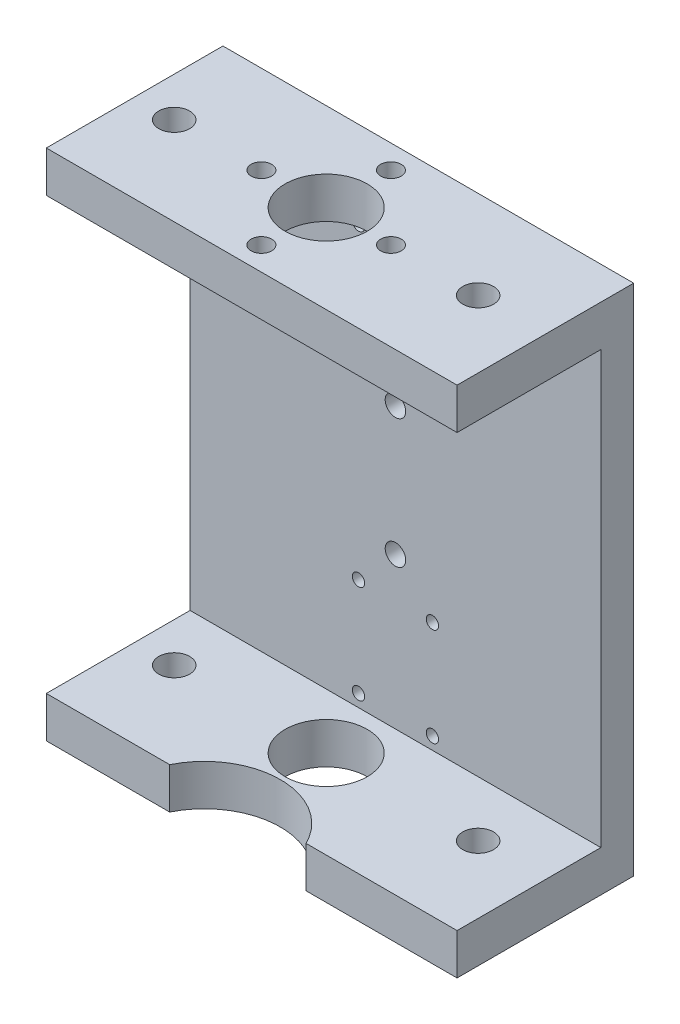
ISO-10303-21;
HEADER;
FILE_DESCRIPTION(('STEP AP214'),'2;1');
FILE_NAME('part.step','',(''),(''),'','','');
FILE_SCHEMA(('AUTOMOTIVE_DESIGN { 1 0 10303 214 1 1 1 1 }'));
ENDSEC;
DATA;
#1=APPLICATION_CONTEXT('core data for automotive mechanical design processes');
#2=APPLICATION_PROTOCOL_DEFINITION('international standard','automotive_design',2000,#1);
#3=PRODUCT_CONTEXT('',#1,'mechanical');
#4=PRODUCT('Part','Part','',(#3));
#5=PRODUCT_RELATED_PRODUCT_CATEGORY('part','',(#4));
#6=PRODUCT_DEFINITION_FORMATION('','',#4);
#7=PRODUCT_DEFINITION_CONTEXT('part definition',#1,'design');
#8=PRODUCT_DEFINITION('design','',#6,#7);
#9=PRODUCT_DEFINITION_SHAPE('','',#8);
#10=(LENGTH_UNIT() NAMED_UNIT(*) SI_UNIT(.MILLI.,.METRE.));
#11=(NAMED_UNIT(*) PLANE_ANGLE_UNIT() SI_UNIT($,.RADIAN.));
#12=(NAMED_UNIT(*) SI_UNIT($,.STERADIAN.) SOLID_ANGLE_UNIT());
#13=UNCERTAINTY_MEASURE_WITH_UNIT(LENGTH_MEASURE(1.E-05),#10,'distance_accuracy_value','');
#14=(GEOMETRIC_REPRESENTATION_CONTEXT(3) GLOBAL_UNCERTAINTY_ASSIGNED_CONTEXT((#13)) GLOBAL_UNIT_ASSIGNED_CONTEXT((#10,
#11,#12)) REPRESENTATION_CONTEXT('',''));
#15=CARTESIAN_POINT('',(0.,0.,0.));
#16=DIRECTION('',(0.,0.,1.));
#17=DIRECTION('',(1.,0.,0.));
#18=AXIS2_PLACEMENT_3D('',#15,#16,#17);
#19=CARTESIAN_POINT('',(0.,0.,43.));
#20=DIRECTION('',(0.,0.,1.));
#21=DIRECTION('',(1.,0.,0.));
#22=AXIS2_PLACEMENT_3D('',#19,#20,#21);
#23=PLANE('',#22);
#24=DIRECTION('',(0.,1.,0.));
#25=VECTOR('',#24,1.);
#26=CARTESIAN_POINT('',(13.2357905863533,-45.0000000000001,43.));
#27=LINE('',#26,#25);
#28=CARTESIAN_POINT('',(13.2357905863533,-45.0000000000001,43.));
#29=VERTEX_POINT('',#28);
#30=CARTESIAN_POINT('',(13.2357905863533,-35.,43.));
#31=VERTEX_POINT('',#30);
#32=EDGE_CURVE('E320',#29,#31,#27,.T.);
#33=ORIENTED_EDGE('',*,*,#32,.F.);
#34=DIRECTION('',(1.,0.,0.));
#35=VECTOR('',#34,1.);
#36=CARTESIAN_POINT('',(-50.,-45.,43.));
#37=LINE('',#36,#35);
#38=CARTESIAN_POINT('',(49.9999999999999,-45.,43.));
#39=VERTEX_POINT('',#38);
#40=EDGE_CURVE('E205',#29,#39,#37,.T.);
#41=ORIENTED_EDGE('',*,*,#40,.T.);
#42=DIRECTION('',(0.,1.,0.));
#43=VECTOR('',#42,1.);
#44=CARTESIAN_POINT('',(49.9999999999999,-45.,43.));
#45=LINE('',#44,#43);
#46=CARTESIAN_POINT('',(49.9999999999999,-35.,43.));
#47=VERTEX_POINT('',#46);
#48=EDGE_CURVE('E203',#39,#47,#45,.T.);
#49=ORIENTED_EDGE('',*,*,#48,.T.);
#50=DIRECTION('',(-1.,0.,0.));
#51=VECTOR('',#50,1.);
#52=CARTESIAN_POINT('',(49.9999999999999,-35.,43.));
#53=LINE('',#52,#51);
#54=EDGE_CURVE('E200',#47,#31,#53,.T.);
#55=ORIENTED_EDGE('',*,*,#54,.T.);
#56=EDGE_LOOP('',(#33,#41,#49,#55));
#57=FACE_BOUND('',#56,.T.);
#58=ADVANCED_FACE('F43',(#57),#23,.T.);
#59=CARTESIAN_POINT('',(0.,0.,8.));
#60=DIRECTION('',(0.,0.,1.));
#61=DIRECTION('',(1.,0.,0.));
#62=AXIS2_PLACEMENT_3D('',#59,#60,#61);
#63=PLANE('',#62);
#64=DIRECTION('',(0.,1.,0.));
#65=VECTOR('',#64,1.);
#66=CARTESIAN_POINT('',(-2.31757458499423,60.,8.));
#67=LINE('',#66,#65);
#68=CARTESIAN_POINT('',(-2.31757458499423,60.,8.));
#69=VERTEX_POINT('',#68);
#70=CARTESIAN_POINT('',(-2.31757458499423,70.,8.));
#71=VERTEX_POINT('',#70);
#72=EDGE_CURVE('E58',#69,#71,#67,.T.);
#73=ORIENTED_EDGE('',*,*,#72,.F.);
#74=DIRECTION('',(-1.,0.,0.));
#75=VECTOR('',#74,1.);
#76=CARTESIAN_POINT('',(0.,60.,8.));
#77=LINE('',#76,#75);
#78=CARTESIAN_POINT('',(-4.41242541500578,60.,8.));
#79=VERTEX_POINT('',#78);
#80=EDGE_CURVE('E11',#69,#79,#77,.T.);
#81=ORIENTED_EDGE('',*,*,#80,.T.);
#82=DIRECTION('',(0.,1.,0.));
#83=VECTOR('',#82,1.);
#84=CARTESIAN_POINT('',(-4.41242541500578,60.,8.));
#85=LINE('',#84,#83);
#86=CARTESIAN_POINT('',(-4.41242541500578,70.,8.));
#87=VERTEX_POINT('',#86);
#88=EDGE_CURVE('E138',#87,#79,#85,.F.);
#89=ORIENTED_EDGE('',*,*,#88,.F.);
#90=DIRECTION('',(1.,0.,0.));
#91=VECTOR('',#90,1.);
#92=CARTESIAN_POINT('',(50.,70.,8.));
#93=LINE('',#92,#91);
#94=CARTESIAN_POINT('',(-50.,70.,8.));
#95=VERTEX_POINT('',#94);
#96=EDGE_CURVE('E212',#95,#87,#93,.T.);
#97=ORIENTED_EDGE('',*,*,#96,.F.);
#98=DIRECTION('',(0.,-1.,0.));
#99=VECTOR('',#98,1.);
#100=CARTESIAN_POINT('',(-50.,80.,8.));
#101=LINE('',#100,#99);
#102=CARTESIAN_POINT('',(-50.,-35.,8.));
#103=VERTEX_POINT('',#102);
#104=EDGE_CURVE('E290',#95,#103,#101,.T.);
#105=ORIENTED_EDGE('',*,*,#104,.T.);
#106=DIRECTION('',(-1.,0.,0.));
#107=VECTOR('',#106,1.);
#108=CARTESIAN_POINT('',(49.9999999999999,-35.,8.));
#109=LINE('',#108,#107);
#110=CARTESIAN_POINT('',(50.,-35.,8.));
#111=VERTEX_POINT('',#110);
#112=EDGE_CURVE('E193',#111,#103,#109,.T.);
#113=ORIENTED_EDGE('',*,*,#112,.F.);
#114=DIRECTION('',(0.,1.,0.));
#115=VECTOR('',#114,1.);
#116=CARTESIAN_POINT('',(50.,80.,8.));
#117=LINE('',#116,#115);
#118=CARTESIAN_POINT('',(50.,70.,8.));
#119=VERTEX_POINT('',#118);
#120=EDGE_CURVE('E288',#111,#119,#117,.T.);
#121=ORIENTED_EDGE('',*,*,#120,.T.);
#122=EDGE_CURVE('E146',#71,#119,#93,.T.);
#123=ORIENTED_EDGE('',*,*,#122,.F.);
#124=EDGE_LOOP('',(#73,#81,#89,#97,#105,#113,#121,#123));
#125=FACE_BOUND('',#124,.T.);
#126=CARTESIAN_POINT('',(8.99999999999993,66.9643641202162,8.));
#127=DIRECTION('',(0.,0.,1.));
#128=DIRECTION('',(1.,0.,0.));
#129=AXIS2_PLACEMENT_3D('',#126,#127,#128);
#130=CIRCLE('',#129,1.50000000000001);
#131=CARTESIAN_POINT('',(10.4999999999999,66.9643641202162,8.));
#132=VERTEX_POINT('',#131);
#133=EDGE_CURVE('E234',#132,#132,#130,.T.);
#134=ORIENTED_EDGE('',*,*,#133,.F.);
#135=EDGE_LOOP('',(#134));
#136=FACE_BOUND('',#135,.T.);
#137=CARTESIAN_POINT('',(-9.00000000000001,43.0356358797838,8.));
#138=DIRECTION('',(0.,0.,1.));
#139=DIRECTION('',(1.,0.,0.));
#140=AXIS2_PLACEMENT_3D('',#137,#138,#139);
#141=CIRCLE('',#140,1.4999999999229);
#142=CARTESIAN_POINT('',(-7.50000000007711,43.0356358797838,8.));
#143=VERTEX_POINT('',#142);
#144=EDGE_CURVE('E246',#143,#143,#141,.T.);
#145=ORIENTED_EDGE('',*,*,#144,.F.);
#146=EDGE_LOOP('',(#145));
#147=FACE_BOUND('',#146,.T.);
#148=CARTESIAN_POINT('',(8.99999999999985,43.0356358797839,8.));
#149=DIRECTION('',(0.,0.,1.));
#150=DIRECTION('',(-1.,0.,0.));
#151=AXIS2_PLACEMENT_3D('',#148,#149,#150);
#152=CIRCLE('',#151,1.4999999999229);
#153=CARTESIAN_POINT('',(7.50000000007694,43.0356358797839,8.));
#154=VERTEX_POINT('',#153);
#155=EDGE_CURVE('E258',#154,#154,#152,.T.);
#156=ORIENTED_EDGE('',*,*,#155,.F.);
#157=EDGE_LOOP('',(#156));
#158=FACE_BOUND('',#157,.T.);
#159=CARTESIAN_POINT('',(8.99999999999996,-31.9643641202162,8.));
#160=DIRECTION('',(0.,0.,1.));
#161=DIRECTION('',(-1.,0.,0.));
#162=AXIS2_PLACEMENT_3D('',#159,#160,#161);
#163=CIRCLE('',#162,1.50000000000001);
#164=CARTESIAN_POINT('',(7.49999999999995,-31.9643641202162,8.));
#165=VERTEX_POINT('',#164);
#166=EDGE_CURVE('E270',#165,#165,#163,.T.);
#167=ORIENTED_EDGE('',*,*,#166,.F.);
#168=EDGE_LOOP('',(#167));
#169=FACE_BOUND('',#168,.T.);
#170=CARTESIAN_POINT('',(0.,33.1800000000001,8.));
#171=DIRECTION('',(0.,0.,1.));
#172=DIRECTION('',(1.,0.,0.));
#173=AXIS2_PLACEMENT_3D('',#170,#171,#172);
#174=CIRCLE('',#173,2.5);
#175=CARTESIAN_POINT('',(2.5,33.1800000000001,8.));
#176=VERTEX_POINT('',#175);
#177=EDGE_CURVE('E282',#176,#176,#174,.T.);
#178=ORIENTED_EDGE('',*,*,#177,.F.);
#179=EDGE_LOOP('',(#178));
#180=FACE_BOUND('',#179,.T.);
#181=CARTESIAN_POINT('',(-8.99999999999988,-31.9643641202161,8.));
#182=DIRECTION('',(0.,0.,1.));
#183=DIRECTION('',(1.,0.,0.));
#184=AXIS2_PLACEMENT_3D('',#181,#182,#183);
#185=CIRCLE('',#184,1.4999999999229);
#186=CARTESIAN_POINT('',(-7.50000000007697,-31.9643641202161,8.));
#187=VERTEX_POINT('',#186);
#188=EDGE_CURVE('E276',#187,#187,#185,.T.);
#189=ORIENTED_EDGE('',*,*,#188,.F.);
#190=EDGE_LOOP('',(#189));
#191=FACE_BOUND('',#190,.T.);
#192=CARTESIAN_POINT('',(8.99999999999984,-8.03563587978385,8.));
#193=DIRECTION('',(0.,0.,1.));
#194=DIRECTION('',(1.,0.,0.));
#195=AXIS2_PLACEMENT_3D('',#192,#193,#194);
#196=CIRCLE('',#195,1.4999999999229);
#197=CARTESIAN_POINT('',(10.4999999999227,-8.03563587978385,8.));
#198=VERTEX_POINT('',#197);
#199=EDGE_CURVE('E264',#198,#198,#196,.T.);
#200=ORIENTED_EDGE('',*,*,#199,.F.);
#201=EDGE_LOOP('',(#200));
#202=FACE_BOUND('',#201,.T.);
#203=CARTESIAN_POINT('',(-9.,-8.03563587978383,8.));
#204=DIRECTION('',(0.,0.,1.));
#205=DIRECTION('',(-1.,0.,0.));
#206=AXIS2_PLACEMENT_3D('',#203,#204,#205);
#207=CIRCLE('',#206,1.49999999992291);
#208=CARTESIAN_POINT('',(-10.4999999999229,-8.03563587978383,8.));
#209=VERTEX_POINT('',#208);
#210=EDGE_CURVE('E252',#209,#209,#207,.T.);
#211=ORIENTED_EDGE('',*,*,#210,.F.);
#212=EDGE_LOOP('',(#211));
#213=FACE_BOUND('',#212,.T.);
#214=CARTESIAN_POINT('',(-8.9999999999999,66.9643641202161,8.));
#215=DIRECTION('',(0.,0.,1.));
#216=DIRECTION('',(-1.,0.,0.));
#217=AXIS2_PLACEMENT_3D('',#214,#215,#216);
#218=CIRCLE('',#217,1.49999999992291);
#219=CARTESIAN_POINT('',(-10.4999999999228,66.9643641202161,8.));
#220=VERTEX_POINT('',#219);
#221=EDGE_CURVE('E240',#220,#220,#218,.T.);
#222=ORIENTED_EDGE('',*,*,#221,.F.);
#223=EDGE_LOOP('',(#222));
#224=FACE_BOUND('',#223,.T.);
#225=CARTESIAN_POINT('',(0.,1.82000000000006,8.));
#226=DIRECTION('',(0.,0.,1.));
#227=DIRECTION('',(1.,0.,0.));
#228=AXIS2_PLACEMENT_3D('',#225,#226,#227);
#229=CIRCLE('',#228,2.5);
#230=CARTESIAN_POINT('',(2.5,1.82000000000006,8.));
#231=VERTEX_POINT('',#230);
#232=EDGE_CURVE('E228',#231,#231,#229,.T.);
#233=ORIENTED_EDGE('',*,*,#232,.F.);
#234=EDGE_LOOP('',(#233));
#235=FACE_BOUND('',#234,.T.);
#236=ADVANCED_FACE('F143',(#125,#136,#147,#158,#169,#180,#191,#202,#213,#224,#235),#63,.T.);
#237=CARTESIAN_POINT('',(0.,0.,0.));
#238=DIRECTION('',(0.,0.,1.));
#239=DIRECTION('',(1.,0.,0.));
#240=AXIS2_PLACEMENT_3D('',#237,#238,#239);
#241=PLANE('',#240);
#242=DIRECTION('',(0.,1.,0.));
#243=VECTOR('',#242,1.);
#244=CARTESIAN_POINT('',(50.,80.,0.));
#245=LINE('',#244,#243);
#246=CARTESIAN_POINT('',(50.,-45.,0.));
#247=VERTEX_POINT('',#246);
#248=CARTESIAN_POINT('',(50.,80.,0.));
#249=VERTEX_POINT('',#248);
#250=EDGE_CURVE('E285',#247,#249,#245,.T.);
#251=ORIENTED_EDGE('',*,*,#250,.F.);
#252=DIRECTION('',(1.,0.,0.));
#253=VECTOR('',#252,1.);
#254=CARTESIAN_POINT('',(-50.,-45.,0.));
#255=LINE('',#254,#253);
#256=CARTESIAN_POINT('',(-50.,-45.,0.));
#257=VERTEX_POINT('',#256);
#258=EDGE_CURVE('E291',#257,#247,#255,.T.);
#259=ORIENTED_EDGE('',*,*,#258,.F.);
#260=DIRECTION('',(0.,-1.,0.));
#261=VECTOR('',#260,1.);
#262=CARTESIAN_POINT('',(-50.,80.,0.));
#263=LINE('',#262,#261);
#264=CARTESIAN_POINT('',(-50.,80.,0.));
#265=VERTEX_POINT('',#264);
#266=EDGE_CURVE('E298',#265,#257,#263,.T.);
#267=ORIENTED_EDGE('',*,*,#266,.F.);
#268=DIRECTION('',(-1.,0.,0.));
#269=VECTOR('',#268,1.);
#270=CARTESIAN_POINT('',(-50.,80.,0.));
#271=LINE('',#270,#269);
#272=EDGE_CURVE('E296',#249,#265,#271,.T.);
#273=ORIENTED_EDGE('',*,*,#272,.F.);
#274=EDGE_LOOP('',(#251,#259,#267,#273));
#275=FACE_BOUND('',#274,.T.);
#276=CARTESIAN_POINT('',(0.,33.1800000000001,0.));
#277=DIRECTION('',(0.,0.,1.));
#278=DIRECTION('',(1.,0.,0.));
#279=AXIS2_PLACEMENT_3D('',#276,#277,#278);
#280=CIRCLE('',#279,2.5);
#281=CARTESIAN_POINT('',(2.5,33.1800000000001,0.));
#282=VERTEX_POINT('',#281);
#283=EDGE_CURVE('E279',#282,#282,#280,.T.);
#284=ORIENTED_EDGE('',*,*,#283,.T.);
#285=EDGE_LOOP('',(#284));
#286=FACE_BOUND('',#285,.T.);
#287=CARTESIAN_POINT('',(-8.99999999999988,-31.9643641202161,0.));
#288=DIRECTION('',(0.,0.,1.));
#289=DIRECTION('',(1.,0.,0.));
#290=AXIS2_PLACEMENT_3D('',#287,#288,#289);
#291=CIRCLE('',#290,1.4999999999229);
#292=CARTESIAN_POINT('',(-7.50000000007697,-31.9643641202161,0.));
#293=VERTEX_POINT('',#292);
#294=EDGE_CURVE('E273',#293,#293,#291,.T.);
#295=ORIENTED_EDGE('',*,*,#294,.T.);
#296=EDGE_LOOP('',(#295));
#297=FACE_BOUND('',#296,.T.);
#298=CARTESIAN_POINT('',(8.99999999999996,-31.9643641202162,0.));
#299=DIRECTION('',(0.,0.,1.));
#300=DIRECTION('',(-1.,0.,0.));
#301=AXIS2_PLACEMENT_3D('',#298,#299,#300);
#302=CIRCLE('',#301,1.50000000000001);
#303=CARTESIAN_POINT('',(7.49999999999995,-31.9643641202162,0.));
#304=VERTEX_POINT('',#303);
#305=EDGE_CURVE('E267',#304,#304,#302,.T.);
#306=ORIENTED_EDGE('',*,*,#305,.T.);
#307=EDGE_LOOP('',(#306));
#308=FACE_BOUND('',#307,.T.);
#309=CARTESIAN_POINT('',(8.99999999999984,-8.03563587978385,0.));
#310=DIRECTION('',(0.,0.,1.));
#311=DIRECTION('',(1.,0.,0.));
#312=AXIS2_PLACEMENT_3D('',#309,#310,#311);
#313=CIRCLE('',#312,1.4999999999229);
#314=CARTESIAN_POINT('',(10.4999999999227,-8.03563587978385,0.));
#315=VERTEX_POINT('',#314);
#316=EDGE_CURVE('E261',#315,#315,#313,.T.);
#317=ORIENTED_EDGE('',*,*,#316,.T.);
#318=EDGE_LOOP('',(#317));
#319=FACE_BOUND('',#318,.T.);
#320=CARTESIAN_POINT('',(8.99999999999985,43.0356358797839,0.));
#321=DIRECTION('',(0.,0.,1.));
#322=DIRECTION('',(-1.,0.,0.));
#323=AXIS2_PLACEMENT_3D('',#320,#321,#322);
#324=CIRCLE('',#323,1.4999999999229);
#325=CARTESIAN_POINT('',(7.50000000007694,43.0356358797839,0.));
#326=VERTEX_POINT('',#325);
#327=EDGE_CURVE('E255',#326,#326,#324,.T.);
#328=ORIENTED_EDGE('',*,*,#327,.T.);
#329=EDGE_LOOP('',(#328));
#330=FACE_BOUND('',#329,.T.);
#331=CARTESIAN_POINT('',(-9.,-8.03563587978383,0.));
#332=DIRECTION('',(0.,0.,1.));
#333=DIRECTION('',(-1.,0.,0.));
#334=AXIS2_PLACEMENT_3D('',#331,#332,#333);
#335=CIRCLE('',#334,1.49999999992291);
#336=CARTESIAN_POINT('',(-10.4999999999229,-8.03563587978383,0.));
#337=VERTEX_POINT('',#336);
#338=EDGE_CURVE('E249',#337,#337,#335,.T.);
#339=ORIENTED_EDGE('',*,*,#338,.T.);
#340=EDGE_LOOP('',(#339));
#341=FACE_BOUND('',#340,.T.);
#342=CARTESIAN_POINT('',(-9.00000000000001,43.0356358797838,0.));
#343=DIRECTION('',(0.,0.,1.));
#344=DIRECTION('',(1.,0.,0.));
#345=AXIS2_PLACEMENT_3D('',#342,#343,#344);
#346=CIRCLE('',#345,1.4999999999229);
#347=CARTESIAN_POINT('',(-7.50000000007711,43.0356358797838,0.));
#348=VERTEX_POINT('',#347);
#349=EDGE_CURVE('E243',#348,#348,#346,.T.);
#350=ORIENTED_EDGE('',*,*,#349,.T.);
#351=EDGE_LOOP('',(#350));
#352=FACE_BOUND('',#351,.T.);
#353=CARTESIAN_POINT('',(-8.9999999999999,66.9643641202161,0.));
#354=DIRECTION('',(0.,0.,1.));
#355=DIRECTION('',(-1.,0.,0.));
#356=AXIS2_PLACEMENT_3D('',#353,#354,#355);
#357=CIRCLE('',#356,1.49999999992291);
#358=CARTESIAN_POINT('',(-10.4999999999228,66.9643641202161,0.));
#359=VERTEX_POINT('',#358);
#360=EDGE_CURVE('E237',#359,#359,#357,.T.);
#361=ORIENTED_EDGE('',*,*,#360,.T.);
#362=EDGE_LOOP('',(#361));
#363=FACE_BOUND('',#362,.T.);
#364=CARTESIAN_POINT('',(8.99999999999993,66.9643641202162,0.));
#365=DIRECTION('',(0.,0.,1.));
#366=DIRECTION('',(1.,0.,0.));
#367=AXIS2_PLACEMENT_3D('',#364,#365,#366);
#368=CIRCLE('',#367,1.50000000000001);
#369=CARTESIAN_POINT('',(10.4999999999999,66.9643641202162,0.));
#370=VERTEX_POINT('',#369);
#371=EDGE_CURVE('E231',#370,#370,#368,.T.);
#372=ORIENTED_EDGE('',*,*,#371,.T.);
#373=EDGE_LOOP('',(#372));
#374=FACE_BOUND('',#373,.T.);
#375=CARTESIAN_POINT('',(0.,1.82000000000006,0.));
#376=DIRECTION('',(0.,0.,1.));
#377=DIRECTION('',(1.,0.,0.));
#378=AXIS2_PLACEMENT_3D('',#375,#376,#377);
#379=CIRCLE('',#378,2.5);
#380=CARTESIAN_POINT('',(2.5,1.82000000000006,0.));
#381=VERTEX_POINT('',#380);
#382=EDGE_CURVE('E227',#381,#381,#379,.T.);
#383=ORIENTED_EDGE('',*,*,#382,.T.);
#384=EDGE_LOOP('',(#383));
#385=FACE_BOUND('',#384,.T.);
#386=ADVANCED_FACE('F348',(#275,#286,#297,#308,#319,#330,#341,#352,#363,#374,#385),#241,.F.);
#387=CARTESIAN_POINT('',(50.,80.,8.));
#388=DIRECTION('',(-1.,0.,0.));
#389=DIRECTION('',(0.,-1.,0.));
#390=AXIS2_PLACEMENT_3D('',#387,#388,#389);
#391=PLANE('',#390);
#392=ORIENTED_EDGE('',*,*,#250,.T.);
#393=DIRECTION('',(0.,0.,-1.));
#394=VECTOR('',#393,1.);
#395=CARTESIAN_POINT('',(50.,80.,8.));
#396=LINE('',#395,#394);
#397=CARTESIAN_POINT('',(50.,80.,43.));
#398=VERTEX_POINT('',#397);
#399=EDGE_CURVE('E309',#398,#249,#396,.T.);
#400=ORIENTED_EDGE('',*,*,#399,.F.);
#401=DIRECTION('',(0.,1.,0.));
#402=VECTOR('',#401,1.);
#403=CARTESIAN_POINT('',(50.,80.,43.));
#404=LINE('',#403,#402);
#405=CARTESIAN_POINT('',(50.,70.,43.));
#406=VERTEX_POINT('',#405);
#407=EDGE_CURVE('E216',#406,#398,#404,.T.);
#408=ORIENTED_EDGE('',*,*,#407,.F.);
#409=DIRECTION('',(0.,0.,-1.));
#410=VECTOR('',#409,1.);
#411=CARTESIAN_POINT('',(50.,70.,43.));
#412=LINE('',#411,#410);
#413=EDGE_CURVE('E219',#406,#119,#412,.T.);
#414=ORIENTED_EDGE('',*,*,#413,.T.);
#415=ORIENTED_EDGE('',*,*,#120,.F.);
#416=DIRECTION('',(0.,0.,-1.));
#417=VECTOR('',#416,1.);
#418=CARTESIAN_POINT('',(49.9999999999999,-35.,43.));
#419=LINE('',#418,#417);
#420=EDGE_CURVE('E186',#47,#111,#419,.T.);
#421=ORIENTED_EDGE('',*,*,#420,.F.);
#422=ORIENTED_EDGE('',*,*,#48,.F.);
#423=DIRECTION('',(0.,0.,-1.));
#424=VECTOR('',#423,1.);
#425=CARTESIAN_POINT('',(50.,-45.,8.));
#426=LINE('',#425,#424);
#427=EDGE_CURVE('E293',#39,#247,#426,.T.);
#428=ORIENTED_EDGE('',*,*,#427,.T.);
#429=EDGE_LOOP('',(#392,#400,#408,#414,#415,#421,#422,#428));
#430=FACE_BOUND('',#429,.T.);
#431=ADVANCED_FACE('F45',(#430),#391,.F.);
#432=CARTESIAN_POINT('',(-50.,80.,8.));
#433=DIRECTION('',(0.,-1.,0.));
#434=DIRECTION('',(0.,0.,-1.));
#435=AXIS2_PLACEMENT_3D('',#432,#433,#434);
#436=PLANE('',#435);
#437=CARTESIAN_POINT('',(-3.36500000000001,80.,5.73));
#438=DIRECTION('',(0.,1.,0.));
#439=DIRECTION('',(0.,0.,1.));
#440=AXIS2_PLACEMENT_3D('',#437,#438,#439);
#441=CIRCLE('',#440,2.5);
#442=CARTESIAN_POINT('',(-3.36500000000001,80.,8.23));
#443=VERTEX_POINT('',#442);
#444=EDGE_CURVE('E140',#443,#443,#441,.T.);
#445=ORIENTED_EDGE('',*,*,#444,.F.);
#446=EDGE_LOOP('',(#445));
#447=FACE_BOUND('',#446,.T.);
#448=CARTESIAN_POINT('',(12.405,80.,21.5));
#449=DIRECTION('',(0.,1.,0.));
#450=DIRECTION('',(0.,0.,1.));
#451=AXIS2_PLACEMENT_3D('',#448,#449,#450);
#452=CIRCLE('',#451,2.5);
#453=CARTESIAN_POINT('',(12.405,80.,24.));
#454=VERTEX_POINT('',#453);
#455=EDGE_CURVE('E837',#454,#454,#452,.T.);
#456=ORIENTED_EDGE('',*,*,#455,.F.);
#457=EDGE_LOOP('',(#456));
#458=FACE_BOUND('',#457,.T.);
#459=CARTESIAN_POINT('',(-19.135,80.,21.5));
#460=DIRECTION('',(0.,1.,0.));
#461=DIRECTION('',(0.,0.,-1.));
#462=AXIS2_PLACEMENT_3D('',#459,#460,#461);
#463=CIRCLE('',#462,2.5);
#464=CARTESIAN_POINT('',(-19.135,80.,19.));
#465=VERTEX_POINT('',#464);
#466=EDGE_CURVE('E838',#465,#465,#463,.T.);
#467=ORIENTED_EDGE('',*,*,#466,.F.);
#468=EDGE_LOOP('',(#467));
#469=FACE_BOUND('',#468,.T.);
#470=CARTESIAN_POINT('',(-3.36500000000001,80.,37.27));
#471=DIRECTION('',(0.,1.,0.));
#472=DIRECTION('',(0.,0.,-1.));
#473=AXIS2_PLACEMENT_3D('',#470,#471,#472);
#474=CIRCLE('',#473,2.5);
#475=CARTESIAN_POINT('',(-3.36500000000001,80.,34.77));
#476=VERTEX_POINT('',#475);
#477=EDGE_CURVE('E843',#476,#476,#474,.T.);
#478=ORIENTED_EDGE('',*,*,#477,.F.);
#479=EDGE_LOOP('',(#478));
#480=FACE_BOUND('',#479,.T.);
#481=CARTESIAN_POINT('',(33.635,80.,21.5));
#482=DIRECTION('',(0.,1.,0.));
#483=DIRECTION('',(0.,0.,1.));
#484=AXIS2_PLACEMENT_3D('',#481,#482,#483);
#485=CIRCLE('',#484,3.75000000000001);
#486=CARTESIAN_POINT('',(33.635,80.,25.25));
#487=VERTEX_POINT('',#486);
#488=EDGE_CURVE('E155',#487,#487,#485,.T.);
#489=ORIENTED_EDGE('',*,*,#488,.F.);
#490=EDGE_LOOP('',(#489));
#491=FACE_BOUND('',#490,.T.);
#492=CARTESIAN_POINT('',(-40.365,80.,21.5));
#493=DIRECTION('',(0.,1.,0.));
#494=DIRECTION('',(0.,0.,1.));
#495=AXIS2_PLACEMENT_3D('',#492,#493,#494);
#496=CIRCLE('',#495,3.75);
#497=CARTESIAN_POINT('',(-40.365,80.,25.25));
#498=VERTEX_POINT('',#497);
#499=EDGE_CURVE('E157',#498,#498,#496,.T.);
#500=ORIENTED_EDGE('',*,*,#499,.F.);
#501=EDGE_LOOP('',(#500));
#502=FACE_BOUND('',#501,.T.);
#503=CARTESIAN_POINT('',(-3.36500000000001,80.,21.5));
#504=DIRECTION('',(0.,1.,0.));
#505=DIRECTION('',(0.,0.,1.));
#506=AXIS2_PLACEMENT_3D('',#503,#504,#505);
#507=CIRCLE('',#506,10.);
#508=CARTESIAN_POINT('',(-3.36500000000001,80.,31.5));
#509=VERTEX_POINT('',#508);
#510=EDGE_CURVE('E160',#509,#509,#507,.T.);
#511=ORIENTED_EDGE('',*,*,#510,.F.);
#512=EDGE_LOOP('',(#511));
#513=FACE_BOUND('',#512,.T.);
#514=ORIENTED_EDGE('',*,*,#272,.T.);
#515=DIRECTION('',(0.,0.,-1.));
#516=VECTOR('',#515,1.);
#517=CARTESIAN_POINT('',(-50.,80.,8.));
#518=LINE('',#517,#516);
#519=CARTESIAN_POINT('',(-50.,80.,43.));
#520=VERTEX_POINT('',#519);
#521=EDGE_CURVE('E306',#520,#265,#518,.T.);
#522=ORIENTED_EDGE('',*,*,#521,.F.);
#523=DIRECTION('',(-1.,0.,0.));
#524=VECTOR('',#523,1.);
#525=CARTESIAN_POINT('',(-50.,80.,43.));
#526=LINE('',#525,#524);
#527=EDGE_CURVE('E208',#398,#520,#526,.T.);
#528=ORIENTED_EDGE('',*,*,#527,.F.);
#529=ORIENTED_EDGE('',*,*,#399,.T.);
#530=EDGE_LOOP('',(#514,#522,#528,#529));
#531=FACE_BOUND('',#530,.T.);
#532=ADVANCED_FACE('F367',(#447,#458,#469,#480,#491,#502,#513,#531),#436,.F.);
#533=CARTESIAN_POINT('',(-50.,80.,8.));
#534=DIRECTION('',(1.,0.,0.));
#535=DIRECTION('',(0.,1.,0.));
#536=AXIS2_PLACEMENT_3D('',#533,#534,#535);
#537=PLANE('',#536);
#538=ORIENTED_EDGE('',*,*,#266,.T.);
#539=DIRECTION('',(0.,0.,-1.));
#540=VECTOR('',#539,1.);
#541=CARTESIAN_POINT('',(-50.,-45.,8.));
#542=LINE('',#541,#540);
#543=CARTESIAN_POINT('',(-50.,-45.,43.));
#544=VERTEX_POINT('',#543);
#545=EDGE_CURVE('E303',#544,#257,#542,.T.);
#546=ORIENTED_EDGE('',*,*,#545,.F.);
#547=DIRECTION('',(0.,-1.,0.));
#548=VECTOR('',#547,1.);
#549=CARTESIAN_POINT('',(-50.,-35.,43.));
#550=LINE('',#549,#548);
#551=CARTESIAN_POINT('',(-50.,-35.,43.));
#552=VERTEX_POINT('',#551);
#553=EDGE_CURVE('E192',#552,#544,#550,.T.);
#554=ORIENTED_EDGE('',*,*,#553,.F.);
#555=DIRECTION('',(0.,0.,-1.));
#556=VECTOR('',#555,1.);
#557=CARTESIAN_POINT('',(-50.,-35.,43.));
#558=LINE('',#557,#556);
#559=EDGE_CURVE('E189',#552,#103,#558,.T.);
#560=ORIENTED_EDGE('',*,*,#559,.T.);
#561=ORIENTED_EDGE('',*,*,#104,.F.);
#562=DIRECTION('',(0.,0.,-1.));
#563=VECTOR('',#562,1.);
#564=CARTESIAN_POINT('',(-50.,70.,43.));
#565=LINE('',#564,#563);
#566=CARTESIAN_POINT('',(-50.,70.,43.));
#567=VERTEX_POINT('',#566);
#568=EDGE_CURVE('E224',#567,#95,#565,.T.);
#569=ORIENTED_EDGE('',*,*,#568,.F.);
#570=DIRECTION('',(0.,-1.,0.));
#571=VECTOR('',#570,1.);
#572=CARTESIAN_POINT('',(-50.,70.,43.));
#573=LINE('',#572,#571);
#574=EDGE_CURVE('E211',#520,#567,#573,.T.);
#575=ORIENTED_EDGE('',*,*,#574,.F.);
#576=ORIENTED_EDGE('',*,*,#521,.T.);
#577=EDGE_LOOP('',(#538,#546,#554,#560,#561,#569,#575,#576));
#578=FACE_BOUND('',#577,.T.);
#579=ADVANCED_FACE('F334',(#578),#537,.F.);
#580=CARTESIAN_POINT('',(-50.,-45.,8.));
#581=DIRECTION('',(0.,1.,0.));
#582=DIRECTION('',(0.,0.,1.));
#583=AXIS2_PLACEMENT_3D('',#580,#581,#582);
#584=PLANE('',#583);
#585=CARTESIAN_POINT('',(33.635,-45.,21.5));
#586=DIRECTION('',(0.,1.,0.));
#587=DIRECTION('',(0.,0.,1.));
#588=AXIS2_PLACEMENT_3D('',#585,#586,#587);
#589=CIRCLE('',#588,3.75000000000001);
#590=CARTESIAN_POINT('',(33.635,-45.,25.25));
#591=VERTEX_POINT('',#590);
#592=EDGE_CURVE('E183',#591,#591,#589,.T.);
#593=ORIENTED_EDGE('',*,*,#592,.T.);
#594=EDGE_LOOP('',(#593));
#595=FACE_BOUND('',#594,.T.);
#596=CARTESIAN_POINT('',(-40.365,-45.,21.5));
#597=DIRECTION('',(0.,1.,0.));
#598=DIRECTION('',(0.,0.,1.));
#599=AXIS2_PLACEMENT_3D('',#596,#597,#598);
#600=CIRCLE('',#599,3.75);
#601=CARTESIAN_POINT('',(-40.365,-45.,25.25));
#602=VERTEX_POINT('',#601);
#603=EDGE_CURVE('E176',#602,#602,#600,.T.);
#604=ORIENTED_EDGE('',*,*,#603,.T.);
#605=EDGE_LOOP('',(#604));
#606=FACE_BOUND('',#605,.T.);
#607=CARTESIAN_POINT('',(-3.36500000000001,-45.,21.5));
#608=DIRECTION('',(0.,1.,0.));
#609=DIRECTION('',(0.,0.,1.));
#610=AXIS2_PLACEMENT_3D('',#607,#608,#609);
#611=CIRCLE('',#610,10.);
#612=CARTESIAN_POINT('',(-3.36500000000001,-45.,31.5));
#613=VERTEX_POINT('',#612);
#614=EDGE_CURVE('E169',#613,#613,#611,.T.);
#615=ORIENTED_EDGE('',*,*,#614,.T.);
#616=EDGE_LOOP('',(#615));
#617=FACE_BOUND('',#616,.T.);
#618=ORIENTED_EDGE('',*,*,#40,.F.);
#619=CARTESIAN_POINT('',(-3.36500000000001,-45.,51.1647873155425));
#620=DIRECTION('',(0.,1.,0.));
#621=DIRECTION('',(-1.,0.,0.));
#622=AXIS2_PLACEMENT_3D('',#619,#620,#621);
#623=CIRCLE('',#622,18.5);
#624=CARTESIAN_POINT('',(-19.9657905863533,-45.,43.));
#625=VERTEX_POINT('',#624);
#626=EDGE_CURVE('E148',#29,#625,#623,.T.);
#627=ORIENTED_EDGE('',*,*,#626,.T.);
#628=EDGE_CURVE('E196',#544,#625,#37,.T.);
#629=ORIENTED_EDGE('',*,*,#628,.F.);
#630=ORIENTED_EDGE('',*,*,#545,.T.);
#631=ORIENTED_EDGE('',*,*,#258,.T.);
#632=ORIENTED_EDGE('',*,*,#427,.F.);
#633=EDGE_LOOP('',(#618,#627,#629,#630,#631,#632));
#634=FACE_BOUND('',#633,.T.);
#635=ADVANCED_FACE('F353',(#595,#606,#617,#634),#584,.F.);
#636=CARTESIAN_POINT('',(0.,33.1800000000001,8.));
#637=DIRECTION('',(0.,0.,-1.));
#638=DIRECTION('',(-1.,0.,0.));
#639=AXIS2_PLACEMENT_3D('',#636,#637,#638);
#640=CYLINDRICAL_SURFACE('',#639,2.5);
#641=ORIENTED_EDGE('',*,*,#177,.T.);
#642=EDGE_LOOP('',(#641));
#643=FACE_BOUND('',#642,.T.);
#644=ORIENTED_EDGE('',*,*,#283,.F.);
#645=EDGE_LOOP('',(#644));
#646=FACE_BOUND('',#645,.T.);
#647=ADVANCED_FACE('F611',(#643,#646),#640,.F.);
#648=CARTESIAN_POINT('',(-8.99999999999988,-31.9643641202161,8.));
#649=DIRECTION('',(0.,0.,-1.));
#650=DIRECTION('',(-1.,0.,0.));
#651=AXIS2_PLACEMENT_3D('',#648,#649,#650);
#652=CYLINDRICAL_SURFACE('',#651,1.4999999999229);
#653=ORIENTED_EDGE('',*,*,#188,.T.);
#654=EDGE_LOOP('',(#653));
#655=FACE_BOUND('',#654,.T.);
#656=ORIENTED_EDGE('',*,*,#294,.F.);
#657=EDGE_LOOP('',(#656));
#658=FACE_BOUND('',#657,.T.);
#659=ADVANCED_FACE('F600',(#655,#658),#652,.F.);
#660=CARTESIAN_POINT('',(8.99999999999996,-31.9643641202162,8.));
#661=DIRECTION('',(0.,0.,-1.));
#662=DIRECTION('',(-1.,0.,0.));
#663=AXIS2_PLACEMENT_3D('',#660,#661,#662);
#664=CYLINDRICAL_SURFACE('',#663,1.50000000000001);
#665=ORIENTED_EDGE('',*,*,#166,.T.);
#666=EDGE_LOOP('',(#665));
#667=FACE_BOUND('',#666,.T.);
#668=ORIENTED_EDGE('',*,*,#305,.F.);
#669=EDGE_LOOP('',(#668));
#670=FACE_BOUND('',#669,.T.);
#671=ADVANCED_FACE('F589',(#667,#670),#664,.F.);
#672=CARTESIAN_POINT('',(8.99999999999984,-8.03563587978385,8.));
#673=DIRECTION('',(0.,0.,-1.));
#674=DIRECTION('',(-1.,0.,0.));
#675=AXIS2_PLACEMENT_3D('',#672,#673,#674);
#676=CYLINDRICAL_SURFACE('',#675,1.4999999999229);
#677=ORIENTED_EDGE('',*,*,#199,.T.);
#678=EDGE_LOOP('',(#677));
#679=FACE_BOUND('',#678,.T.);
#680=ORIENTED_EDGE('',*,*,#316,.F.);
#681=EDGE_LOOP('',(#680));
#682=FACE_BOUND('',#681,.T.);
#683=ADVANCED_FACE('F578',(#679,#682),#676,.F.);
#684=CARTESIAN_POINT('',(8.99999999999985,43.0356358797839,8.));
#685=DIRECTION('',(0.,0.,-1.));
#686=DIRECTION('',(-1.,0.,0.));
#687=AXIS2_PLACEMENT_3D('',#684,#685,#686);
#688=CYLINDRICAL_SURFACE('',#687,1.4999999999229);
#689=ORIENTED_EDGE('',*,*,#155,.T.);
#690=EDGE_LOOP('',(#689));
#691=FACE_BOUND('',#690,.T.);
#692=ORIENTED_EDGE('',*,*,#327,.F.);
#693=EDGE_LOOP('',(#692));
#694=FACE_BOUND('',#693,.T.);
#695=ADVANCED_FACE('F567',(#691,#694),#688,.F.);
#696=CARTESIAN_POINT('',(-9.,-8.03563587978383,8.));
#697=DIRECTION('',(0.,0.,-1.));
#698=DIRECTION('',(-1.,0.,0.));
#699=AXIS2_PLACEMENT_3D('',#696,#697,#698);
#700=CYLINDRICAL_SURFACE('',#699,1.49999999992291);
#701=ORIENTED_EDGE('',*,*,#210,.T.);
#702=EDGE_LOOP('',(#701));
#703=FACE_BOUND('',#702,.T.);
#704=ORIENTED_EDGE('',*,*,#338,.F.);
#705=EDGE_LOOP('',(#704));
#706=FACE_BOUND('',#705,.T.);
#707=ADVANCED_FACE('F556',(#703,#706),#700,.F.);
#708=CARTESIAN_POINT('',(-9.00000000000001,43.0356358797838,8.));
#709=DIRECTION('',(0.,0.,-1.));
#710=DIRECTION('',(-1.,0.,0.));
#711=AXIS2_PLACEMENT_3D('',#708,#709,#710);
#712=CYLINDRICAL_SURFACE('',#711,1.4999999999229);
#713=ORIENTED_EDGE('',*,*,#144,.T.);
#714=EDGE_LOOP('',(#713));
#715=FACE_BOUND('',#714,.T.);
#716=ORIENTED_EDGE('',*,*,#349,.F.);
#717=EDGE_LOOP('',(#716));
#718=FACE_BOUND('',#717,.T.);
#719=ADVANCED_FACE('F545',(#715,#718),#712,.F.);
#720=CARTESIAN_POINT('',(-8.9999999999999,66.9643641202161,8.));
#721=DIRECTION('',(0.,0.,-1.));
#722=DIRECTION('',(-1.,0.,0.));
#723=AXIS2_PLACEMENT_3D('',#720,#721,#722);
#724=CYLINDRICAL_SURFACE('',#723,1.49999999992291);
#725=ORIENTED_EDGE('',*,*,#221,.T.);
#726=EDGE_LOOP('',(#725));
#727=FACE_BOUND('',#726,.T.);
#728=ORIENTED_EDGE('',*,*,#360,.F.);
#729=EDGE_LOOP('',(#728));
#730=FACE_BOUND('',#729,.T.);
#731=ADVANCED_FACE('F534',(#727,#730),#724,.F.);
#732=CARTESIAN_POINT('',(8.99999999999993,66.9643641202162,8.));
#733=DIRECTION('',(0.,0.,-1.));
#734=DIRECTION('',(-1.,0.,0.));
#735=AXIS2_PLACEMENT_3D('',#732,#733,#734);
#736=CYLINDRICAL_SURFACE('',#735,1.50000000000001);
#737=ORIENTED_EDGE('',*,*,#133,.T.);
#738=EDGE_LOOP('',(#737));
#739=FACE_BOUND('',#738,.T.);
#740=ORIENTED_EDGE('',*,*,#371,.F.);
#741=EDGE_LOOP('',(#740));
#742=FACE_BOUND('',#741,.T.);
#743=ADVANCED_FACE('F522',(#739,#742),#736,.F.);
#744=CARTESIAN_POINT('',(0.,1.82000000000006,8.));
#745=DIRECTION('',(0.,0.,-1.));
#746=DIRECTION('',(-1.,0.,0.));
#747=AXIS2_PLACEMENT_3D('',#744,#745,#746);
#748=CYLINDRICAL_SURFACE('',#747,2.5);
#749=ORIENTED_EDGE('',*,*,#232,.T.);
#750=EDGE_LOOP('',(#749));
#751=FACE_BOUND('',#750,.T.);
#752=ORIENTED_EDGE('',*,*,#382,.F.);
#753=EDGE_LOOP('',(#752));
#754=FACE_BOUND('',#753,.T.);
#755=ADVANCED_FACE('F517',(#751,#754),#748,.F.);
#756=CARTESIAN_POINT('',(50.,70.,43.));
#757=DIRECTION('',(0.,1.,0.));
#758=DIRECTION('',(-1.,0.,0.));
#759=AXIS2_PLACEMENT_3D('',#756,#757,#758);
#760=PLANE('',#759);
#761=CARTESIAN_POINT('',(12.405,70.,21.5));
#762=DIRECTION('',(0.,1.,0.));
#763=DIRECTION('',(-1.,0.,0.));
#764=AXIS2_PLACEMENT_3D('',#761,#762,#763);
#765=CIRCLE('',#764,2.5);
#766=CARTESIAN_POINT('',(9.90499999999999,70.,21.5));
#767=VERTEX_POINT('',#766);
#768=EDGE_CURVE('E150',#767,#767,#765,.T.);
#769=ORIENTED_EDGE('',*,*,#768,.T.);
#770=EDGE_LOOP('',(#769));
#771=FACE_BOUND('',#770,.T.);
#772=CARTESIAN_POINT('',(-19.135,70.,21.5));
#773=DIRECTION('',(0.,1.,0.));
#774=DIRECTION('',(-1.,0.,0.));
#775=AXIS2_PLACEMENT_3D('',#772,#773,#774);
#776=CIRCLE('',#775,2.5);
#777=CARTESIAN_POINT('',(-21.635,70.,21.5));
#778=VERTEX_POINT('',#777);
#779=EDGE_CURVE('E324',#778,#778,#776,.T.);
#780=ORIENTED_EDGE('',*,*,#779,.T.);
#781=EDGE_LOOP('',(#780));
#782=FACE_BOUND('',#781,.T.);
#783=CARTESIAN_POINT('',(-3.36500000000001,70.,37.27));
#784=DIRECTION('',(0.,1.,0.));
#785=DIRECTION('',(-1.,0.,0.));
#786=AXIS2_PLACEMENT_3D('',#783,#784,#785);
#787=CIRCLE('',#786,2.5);
#788=CARTESIAN_POINT('',(-5.86500000000001,70.,37.27));
#789=VERTEX_POINT('',#788);
#790=EDGE_CURVE('E139',#789,#789,#787,.T.);
#791=ORIENTED_EDGE('',*,*,#790,.T.);
#792=EDGE_LOOP('',(#791));
#793=FACE_BOUND('',#792,.T.);
#794=CARTESIAN_POINT('',(33.635,70.,21.5));
#795=DIRECTION('',(0.,1.,0.));
#796=DIRECTION('',(-1.,0.,0.));
#797=AXIS2_PLACEMENT_3D('',#794,#795,#796);
#798=CIRCLE('',#797,3.75000000000001);
#799=CARTESIAN_POINT('',(29.885,70.,21.5));
#800=VERTEX_POINT('',#799);
#801=EDGE_CURVE('E180',#800,#800,#798,.T.);
#802=ORIENTED_EDGE('',*,*,#801,.T.);
#803=EDGE_LOOP('',(#802));
#804=FACE_BOUND('',#803,.T.);
#805=CARTESIAN_POINT('',(-40.365,70.,21.5));
#806=DIRECTION('',(0.,1.,0.));
#807=DIRECTION('',(-1.,0.,0.));
#808=AXIS2_PLACEMENT_3D('',#805,#806,#807);
#809=CIRCLE('',#808,3.75);
#810=CARTESIAN_POINT('',(-44.115,70.,21.5));
#811=VERTEX_POINT('',#810);
#812=EDGE_CURVE('E173',#811,#811,#809,.T.);
#813=ORIENTED_EDGE('',*,*,#812,.T.);
#814=EDGE_LOOP('',(#813));
#815=FACE_BOUND('',#814,.T.);
#816=CARTESIAN_POINT('',(-3.36500000000001,70.,21.5));
#817=DIRECTION('',(0.,1.,0.));
#818=DIRECTION('',(-1.,0.,0.));
#819=AXIS2_PLACEMENT_3D('',#816,#817,#818);
#820=CIRCLE('',#819,10.);
#821=CARTESIAN_POINT('',(-13.365,70.,21.5));
#822=VERTEX_POINT('',#821);
#823=EDGE_CURVE('E166',#822,#822,#820,.T.);
#824=ORIENTED_EDGE('',*,*,#823,.T.);
#825=EDGE_LOOP('',(#824));
#826=FACE_BOUND('',#825,.T.);
#827=ORIENTED_EDGE('',*,*,#96,.T.);
#828=CARTESIAN_POINT('',(-3.36500000000001,70.,5.73));
#829=DIRECTION('',(0.,1.,0.));
#830=DIRECTION('',(-1.,0.,0.));
#831=AXIS2_PLACEMENT_3D('',#828,#829,#830);
#832=CIRCLE('',#831,2.5);
#833=EDGE_CURVE('E51',#87,#71,#832,.T.);
#834=ORIENTED_EDGE('',*,*,#833,.T.);
#835=ORIENTED_EDGE('',*,*,#122,.T.);
#836=ORIENTED_EDGE('',*,*,#413,.F.);
#837=DIRECTION('',(1.,0.,0.));
#838=VECTOR('',#837,1.);
#839=CARTESIAN_POINT('',(50.,70.,43.));
#840=LINE('',#839,#838);
#841=EDGE_CURVE('E214',#567,#406,#840,.T.);
#842=ORIENTED_EDGE('',*,*,#841,.F.);
#843=ORIENTED_EDGE('',*,*,#568,.T.);
#844=EDGE_LOOP('',(#827,#834,#835,#836,#842,#843));
#845=FACE_BOUND('',#844,.T.);
#846=ADVANCED_FACE('F329',(#771,#782,#793,#804,#815,#826,#845),#760,.F.);
#847=CARTESIAN_POINT('',(0.,0.,43.));
#848=DIRECTION('',(0.,0.,-1.));
#849=DIRECTION('',(-1.,0.,0.));
#850=AXIS2_PLACEMENT_3D('',#847,#848,#849);
#851=PLANE('',#850);
#852=ORIENTED_EDGE('',*,*,#527,.T.);
#853=ORIENTED_EDGE('',*,*,#574,.T.);
#854=ORIENTED_EDGE('',*,*,#841,.T.);
#855=ORIENTED_EDGE('',*,*,#407,.T.);
#856=EDGE_LOOP('',(#852,#853,#854,#855));
#857=FACE_BOUND('',#856,.T.);
#858=ADVANCED_FACE('F341',(#857),#851,.F.);
#859=CARTESIAN_POINT('',(49.9999999999999,-35.,43.));
#860=DIRECTION('',(0.,-1.,0.));
#861=DIRECTION('',(1.,0.,0.));
#862=AXIS2_PLACEMENT_3D('',#859,#860,#861);
#863=PLANE('',#862);
#864=CARTESIAN_POINT('',(33.635,-35.,21.5));
#865=DIRECTION('',(0.,-1.,0.));
#866=DIRECTION('',(1.,0.,0.));
#867=AXIS2_PLACEMENT_3D('',#864,#865,#866);
#868=CIRCLE('',#867,3.75000000000001);
#869=CARTESIAN_POINT('',(37.385,-35.,21.5));
#870=VERTEX_POINT('',#869);
#871=EDGE_CURVE('E179',#870,#870,#868,.T.);
#872=ORIENTED_EDGE('',*,*,#871,.T.);
#873=EDGE_LOOP('',(#872));
#874=FACE_BOUND('',#873,.T.);
#875=CARTESIAN_POINT('',(-40.365,-35.,21.5));
#876=DIRECTION('',(0.,-1.,0.));
#877=DIRECTION('',(1.,0.,0.));
#878=AXIS2_PLACEMENT_3D('',#875,#876,#877);
#879=CIRCLE('',#878,3.75);
#880=CARTESIAN_POINT('',(-36.615,-35.,21.5));
#881=VERTEX_POINT('',#880);
#882=EDGE_CURVE('E172',#881,#881,#879,.T.);
#883=ORIENTED_EDGE('',*,*,#882,.T.);
#884=EDGE_LOOP('',(#883));
#885=FACE_BOUND('',#884,.T.);
#886=CARTESIAN_POINT('',(-3.36500000000001,-35.,21.5));
#887=DIRECTION('',(0.,-1.,0.));
#888=DIRECTION('',(1.,0.,0.));
#889=AXIS2_PLACEMENT_3D('',#886,#887,#888);
#890=CIRCLE('',#889,10.);
#891=CARTESIAN_POINT('',(6.635,-35.,21.5));
#892=VERTEX_POINT('',#891);
#893=EDGE_CURVE('E165',#892,#892,#890,.T.);
#894=ORIENTED_EDGE('',*,*,#893,.T.);
#895=EDGE_LOOP('',(#894));
#896=FACE_BOUND('',#895,.T.);
#897=CARTESIAN_POINT('',(-19.9657905863533,-35.,43.));
#898=VERTEX_POINT('',#897);
#899=EDGE_CURVE('E199',#898,#552,#53,.T.);
#900=ORIENTED_EDGE('',*,*,#899,.F.);
#901=CARTESIAN_POINT('',(-3.36500000000001,-35.,51.1647873155425));
#902=DIRECTION('',(0.,1.,0.));
#903=DIRECTION('',(-1.,0.,0.));
#904=AXIS2_PLACEMENT_3D('',#901,#902,#903);
#905=CIRCLE('',#904,18.5);
#906=EDGE_CURVE('E66',#31,#898,#905,.T.);
#907=ORIENTED_EDGE('',*,*,#906,.F.);
#908=ORIENTED_EDGE('',*,*,#54,.F.);
#909=ORIENTED_EDGE('',*,*,#420,.T.);
#910=ORIENTED_EDGE('',*,*,#112,.T.);
#911=ORIENTED_EDGE('',*,*,#559,.F.);
#912=EDGE_LOOP('',(#900,#907,#908,#909,#910,#911));
#913=FACE_BOUND('',#912,.T.);
#914=ADVANCED_FACE('F366',(#874,#885,#896,#913),#863,.F.);
#915=DIRECTION('',(0.,1.,0.));
#916=VECTOR('',#915,1.);
#917=CARTESIAN_POINT('',(-19.9657905863533,-45.,43.));
#918=LINE('',#917,#916);
#919=EDGE_CURVE('E312',#898,#625,#918,.F.);
#920=ORIENTED_EDGE('',*,*,#919,.F.);
#921=ORIENTED_EDGE('',*,*,#899,.T.);
#922=ORIENTED_EDGE('',*,*,#553,.T.);
#923=ORIENTED_EDGE('',*,*,#628,.T.);
#924=EDGE_LOOP('',(#920,#921,#922,#923));
#925=FACE_BOUND('',#924,.T.);
#926=ADVANCED_FACE('F363',(#925),#23,.T.);
#927=CARTESIAN_POINT('',(-3.36500000000001,-210.,21.5));
#928=DIRECTION('',(0.,1.,0.));
#929=DIRECTION('',(0.,0.,1.));
#930=AXIS2_PLACEMENT_3D('',#927,#928,#929);
#931=CYLINDRICAL_SURFACE('',#930,10.);
#932=ORIENTED_EDGE('',*,*,#893,.F.);
#933=EDGE_LOOP('',(#932));
#934=FACE_BOUND('',#933,.T.);
#935=ORIENTED_EDGE('',*,*,#614,.F.);
#936=EDGE_LOOP('',(#935));
#937=FACE_BOUND('',#936,.T.);
#938=ADVANCED_FACE('F388',(#934,#937),#931,.F.);
#939=CARTESIAN_POINT('',(-40.365,-210.,21.5));
#940=DIRECTION('',(0.,1.,0.));
#941=DIRECTION('',(0.,0.,1.));
#942=AXIS2_PLACEMENT_3D('',#939,#940,#941);
#943=CYLINDRICAL_SURFACE('',#942,3.75);
#944=ORIENTED_EDGE('',*,*,#882,.F.);
#945=EDGE_LOOP('',(#944));
#946=FACE_BOUND('',#945,.T.);
#947=ORIENTED_EDGE('',*,*,#603,.F.);
#948=EDGE_LOOP('',(#947));
#949=FACE_BOUND('',#948,.T.);
#950=ADVANCED_FACE('F393',(#946,#949),#943,.F.);
#951=CARTESIAN_POINT('',(33.635,-210.,21.5));
#952=DIRECTION('',(0.,1.,0.));
#953=DIRECTION('',(0.,0.,1.));
#954=AXIS2_PLACEMENT_3D('',#951,#952,#953);
#955=CYLINDRICAL_SURFACE('',#954,3.75000000000001);
#956=ORIENTED_EDGE('',*,*,#871,.F.);
#957=EDGE_LOOP('',(#956));
#958=FACE_BOUND('',#957,.T.);
#959=ORIENTED_EDGE('',*,*,#592,.F.);
#960=EDGE_LOOP('',(#959));
#961=FACE_BOUND('',#960,.T.);
#962=ADVANCED_FACE('F403',(#958,#961),#955,.F.);
#963=ORIENTED_EDGE('',*,*,#510,.T.);
#964=EDGE_LOOP('',(#963));
#965=FACE_BOUND('',#964,.T.);
#966=ORIENTED_EDGE('',*,*,#823,.F.);
#967=EDGE_LOOP('',(#966));
#968=FACE_BOUND('',#967,.T.);
#969=ADVANCED_FACE('F396',(#965,#968),#931,.F.);
#970=ORIENTED_EDGE('',*,*,#499,.T.);
#971=EDGE_LOOP('',(#970));
#972=FACE_BOUND('',#971,.T.);
#973=ORIENTED_EDGE('',*,*,#812,.F.);
#974=EDGE_LOOP('',(#973));
#975=FACE_BOUND('',#974,.T.);
#976=ADVANCED_FACE('F411',(#972,#975),#943,.F.);
#977=ORIENTED_EDGE('',*,*,#488,.T.);
#978=EDGE_LOOP('',(#977));
#979=FACE_BOUND('',#978,.T.);
#980=ORIENTED_EDGE('',*,*,#801,.F.);
#981=EDGE_LOOP('',(#980));
#982=FACE_BOUND('',#981,.T.);
#983=ADVANCED_FACE('F407',(#979,#982),#955,.F.);
#984=CARTESIAN_POINT('',(-3.36500000000001,-45.,51.1647873155425));
#985=DIRECTION('',(0.,1.,0.));
#986=DIRECTION('',(-1.,0.,0.));
#987=AXIS2_PLACEMENT_3D('',#984,#985,#986);
#988=CYLINDRICAL_SURFACE('',#987,18.5);
#989=ORIENTED_EDGE('',*,*,#32,.T.);
#990=ORIENTED_EDGE('',*,*,#906,.T.);
#991=ORIENTED_EDGE('',*,*,#919,.T.);
#992=ORIENTED_EDGE('',*,*,#626,.F.);
#993=EDGE_LOOP('',(#989,#990,#991,#992));
#994=FACE_BOUND('',#993,.T.);
#995=ADVANCED_FACE('F412',(#994),#988,.F.);
#996=CARTESIAN_POINT('',(-3.36500000000001,60.,37.27));
#997=DIRECTION('',(0.,1.,0.));
#998=DIRECTION('',(0.,0.,1.));
#999=AXIS2_PLACEMENT_3D('',#996,#997,#998);
#1000=CYLINDRICAL_SURFACE('',#999,2.5);
#1001=ORIENTED_EDGE('',*,*,#477,.T.);
#1002=EDGE_LOOP('',(#1001));
#1003=FACE_BOUND('',#1002,.T.);
#1004=ORIENTED_EDGE('',*,*,#790,.F.);
#1005=EDGE_LOOP('',(#1004));
#1006=FACE_BOUND('',#1005,.T.);
#1007=ADVANCED_FACE('F415',(#1003,#1006),#1000,.F.);
#1008=CARTESIAN_POINT('',(-19.135,60.,21.5));
#1009=DIRECTION('',(0.,1.,0.));
#1010=DIRECTION('',(0.,0.,1.));
#1011=AXIS2_PLACEMENT_3D('',#1008,#1009,#1010);
#1012=CYLINDRICAL_SURFACE('',#1011,2.5);
#1013=ORIENTED_EDGE('',*,*,#466,.T.);
#1014=EDGE_LOOP('',(#1013));
#1015=FACE_BOUND('',#1014,.T.);
#1016=ORIENTED_EDGE('',*,*,#779,.F.);
#1017=EDGE_LOOP('',(#1016));
#1018=FACE_BOUND('',#1017,.T.);
#1019=ADVANCED_FACE('F418',(#1015,#1018),#1012,.F.);
#1020=CARTESIAN_POINT('',(12.405,60.,21.5));
#1021=DIRECTION('',(0.,1.,0.));
#1022=DIRECTION('',(0.,0.,1.));
#1023=AXIS2_PLACEMENT_3D('',#1020,#1021,#1022);
#1024=CYLINDRICAL_SURFACE('',#1023,2.5);
#1025=ORIENTED_EDGE('',*,*,#455,.T.);
#1026=EDGE_LOOP('',(#1025));
#1027=FACE_BOUND('',#1026,.T.);
#1028=ORIENTED_EDGE('',*,*,#768,.F.);
#1029=EDGE_LOOP('',(#1028));
#1030=FACE_BOUND('',#1029,.T.);
#1031=ADVANCED_FACE('F422',(#1027,#1030),#1024,.F.);
#1032=CARTESIAN_POINT('',(-3.36500000000001,60.,5.73));
#1033=DIRECTION('',(0.,1.,0.));
#1034=DIRECTION('',(0.,0.,1.));
#1035=AXIS2_PLACEMENT_3D('',#1032,#1033,#1034);
#1036=CYLINDRICAL_SURFACE('',#1035,2.5);
#1037=ORIENTED_EDGE('',*,*,#72,.T.);
#1038=ORIENTED_EDGE('',*,*,#833,.F.);
#1039=ORIENTED_EDGE('',*,*,#88,.T.);
#1040=CARTESIAN_POINT('',(-3.36500000000001,60.,5.73));
#1041=DIRECTION('',(0.,1.,0.));
#1042=DIRECTION('',(0.,0.,1.));
#1043=AXIS2_PLACEMENT_3D('',#1040,#1041,#1042);
#1044=CIRCLE('',#1043,2.5);
#1045=EDGE_CURVE('E133',#69,#79,#1044,.T.);
#1046=ORIENTED_EDGE('',*,*,#1045,.F.);
#1047=EDGE_LOOP('',(#1037,#1038,#1039,#1046));
#1048=FACE_BOUND('',#1047,.T.);
#1049=ORIENTED_EDGE('',*,*,#444,.T.);
#1050=EDGE_LOOP('',(#1049));
#1051=FACE_BOUND('',#1050,.T.);
#1052=ADVANCED_FACE('F136',(#1048,#1051),#1036,.F.);
#1053=CARTESIAN_POINT('',(-3.36500000000001,60.,5.73));
#1054=DIRECTION('',(0.,1.,0.));
#1055=DIRECTION('',(0.,0.,1.));
#1056=AXIS2_PLACEMENT_3D('',#1053,#1054,#1055);
#1057=PLANE('',#1056);
#1058=ORIENTED_EDGE('',*,*,#1045,.T.);
#1059=ORIENTED_EDGE('',*,*,#80,.F.);
#1060=EDGE_LOOP('',(#1058,#1059));
#1061=FACE_BOUND('',#1060,.T.);
#1062=ADVANCED_FACE('F132',(#1061),#1057,.T.);
#1063=CLOSED_SHELL('',(#58,#236,#386,#431,#532,#579,#635,#647,#659,#671,#683,#695,#707,#719,
#731,#743,#755,#846,#858,#914,#926,#938,#950,#962,#969,#976,#983,#995,#1007,#1019,#1031,#1052,#1062));
#1064=MANIFOLD_SOLID_BREP('B2',#1063);
#1065=ADVANCED_BREP_SHAPE_REPRESENTATION('',(#18,#1064),#14);
#1066=SHAPE_DEFINITION_REPRESENTATION(#9,#1065);
ENDSEC;
END-ISO-10303-21;
